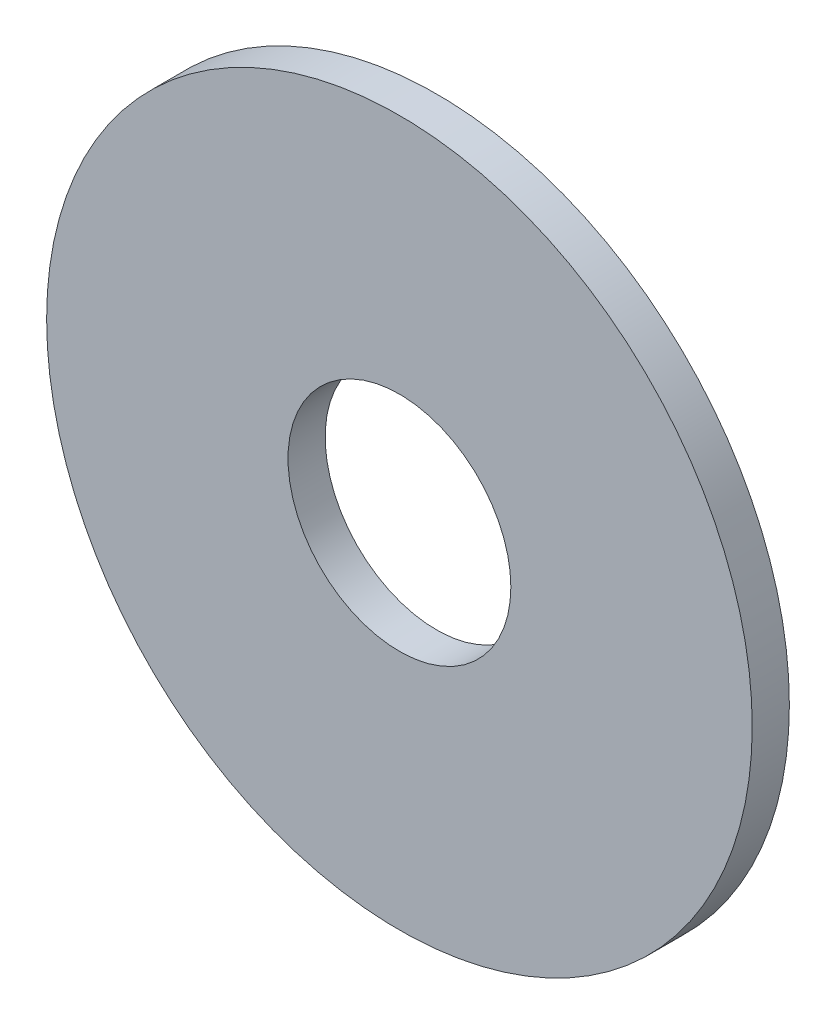
ISO-10303-21;
HEADER;
FILE_DESCRIPTION(('STEP AP214'),'2;1');
FILE_NAME('part.step','',(''),(''),'','','');
FILE_SCHEMA(('AUTOMOTIVE_DESIGN { 1 0 10303 214 1 1 1 1 }'));
ENDSEC;
DATA;
#1=APPLICATION_CONTEXT('core data for automotive mechanical design processes');
#2=APPLICATION_PROTOCOL_DEFINITION('international standard','automotive_design',2000,#1);
#3=PRODUCT_CONTEXT('',#1,'mechanical');
#4=PRODUCT('Part','Part','',(#3));
#5=PRODUCT_RELATED_PRODUCT_CATEGORY('part','',(#4));
#6=PRODUCT_DEFINITION_FORMATION('','',#4);
#7=PRODUCT_DEFINITION_CONTEXT('part definition',#1,'design');
#8=PRODUCT_DEFINITION('design','',#6,#7);
#9=PRODUCT_DEFINITION_SHAPE('','',#8);
#10=(LENGTH_UNIT() NAMED_UNIT(*) SI_UNIT(.MILLI.,.METRE.));
#11=(NAMED_UNIT(*) PLANE_ANGLE_UNIT() SI_UNIT($,.RADIAN.));
#12=(NAMED_UNIT(*) SI_UNIT($,.STERADIAN.) SOLID_ANGLE_UNIT());
#13=UNCERTAINTY_MEASURE_WITH_UNIT(LENGTH_MEASURE(1.E-05),#10,'distance_accuracy_value','');
#14=(GEOMETRIC_REPRESENTATION_CONTEXT(3) GLOBAL_UNCERTAINTY_ASSIGNED_CONTEXT((#13)) GLOBAL_UNIT_ASSIGNED_CONTEXT((#10,
#11,#12)) REPRESENTATION_CONTEXT('',''));
#15=CARTESIAN_POINT('',(0.,0.,0.));
#16=DIRECTION('',(0.,0.,1.));
#17=DIRECTION('',(1.,0.,0.));
#18=AXIS2_PLACEMENT_3D('',#15,#16,#17);
#19=CARTESIAN_POINT('',(0.,0.,1.));
#20=DIRECTION('',(0.,0.,1.));
#21=DIRECTION('',(1.,0.,0.));
#22=AXIS2_PLACEMENT_3D('',#19,#20,#21);
#23=PLANE('',#22);
#24=CARTESIAN_POINT('',(0.,0.,1.));
#25=DIRECTION('',(0.,0.,1.));
#26=DIRECTION('',(1.,0.,0.));
#27=AXIS2_PLACEMENT_3D('',#24,#25,#26);
#28=CIRCLE('',#27,9.5);
#29=CARTESIAN_POINT('',(9.5,0.,1.));
#30=VERTEX_POINT('',#29);
#31=EDGE_CURVE('E10',#30,#30,#28,.T.);
#32=ORIENTED_EDGE('',*,*,#31,.T.);
#33=EDGE_LOOP('',(#32));
#34=FACE_BOUND('',#33,.T.);
#35=CARTESIAN_POINT('',(0.,0.,1.));
#36=DIRECTION('',(0.,0.,1.));
#37=DIRECTION('',(1.,0.,0.));
#38=AXIS2_PLACEMENT_3D('',#35,#36,#37);
#39=CIRCLE('',#38,3.);
#40=CARTESIAN_POINT('',(3.,0.,1.));
#41=VERTEX_POINT('',#40);
#42=EDGE_CURVE('E51',#41,#41,#39,.T.);
#43=ORIENTED_EDGE('',*,*,#42,.F.);
#44=EDGE_LOOP('',(#43));
#45=FACE_BOUND('',#44,.T.);
#46=ADVANCED_FACE('F40',(#34,#45),#23,.T.);
#47=CARTESIAN_POINT('',(0.,0.,0.));
#48=DIRECTION('',(0.,0.,1.));
#49=DIRECTION('',(1.,0.,0.));
#50=AXIS2_PLACEMENT_3D('',#47,#48,#49);
#51=PLANE('',#50);
#52=CARTESIAN_POINT('',(0.,0.,0.));
#53=DIRECTION('',(0.,0.,1.));
#54=DIRECTION('',(1.,0.,0.));
#55=AXIS2_PLACEMENT_3D('',#52,#53,#54);
#56=CIRCLE('',#55,9.5);
#57=CARTESIAN_POINT('',(9.5,0.,0.));
#58=VERTEX_POINT('',#57);
#59=EDGE_CURVE('E44',#58,#58,#56,.T.);
#60=ORIENTED_EDGE('',*,*,#59,.F.);
#61=EDGE_LOOP('',(#60));
#62=FACE_BOUND('',#61,.T.);
#63=CARTESIAN_POINT('',(0.,0.,0.));
#64=DIRECTION('',(0.,0.,1.));
#65=DIRECTION('',(1.,0.,0.));
#66=AXIS2_PLACEMENT_3D('',#63,#64,#65);
#67=CIRCLE('',#66,3.);
#68=CARTESIAN_POINT('',(3.,0.,0.));
#69=VERTEX_POINT('',#68);
#70=EDGE_CURVE('E53',#69,#69,#67,.T.);
#71=ORIENTED_EDGE('',*,*,#70,.T.);
#72=EDGE_LOOP('',(#71));
#73=FACE_BOUND('',#72,.T.);
#74=ADVANCED_FACE('F63',(#62,#73),#51,.F.);
#75=CARTESIAN_POINT('',(0.,0.,1.));
#76=DIRECTION('',(0.,0.,-1.));
#77=DIRECTION('',(-1.,0.,0.));
#78=AXIS2_PLACEMENT_3D('',#75,#76,#77);
#79=CYLINDRICAL_SURFACE('',#78,9.5);
#80=ORIENTED_EDGE('',*,*,#31,.F.);
#81=EDGE_LOOP('',(#80));
#82=FACE_BOUND('',#81,.T.);
#83=ORIENTED_EDGE('',*,*,#59,.T.);
#84=EDGE_LOOP('',(#83));
#85=FACE_BOUND('',#84,.T.);
#86=ADVANCED_FACE('F42',(#82,#85),#79,.T.);
#87=CARTESIAN_POINT('',(0.,0.,1.));
#88=DIRECTION('',(0.,0.,-1.));
#89=DIRECTION('',(-1.,0.,0.));
#90=AXIS2_PLACEMENT_3D('',#87,#88,#89);
#91=CYLINDRICAL_SURFACE('',#90,3.);
#92=ORIENTED_EDGE('',*,*,#42,.T.);
#93=EDGE_LOOP('',(#92));
#94=FACE_BOUND('',#93,.T.);
#95=ORIENTED_EDGE('',*,*,#70,.F.);
#96=EDGE_LOOP('',(#95));
#97=FACE_BOUND('',#96,.T.);
#98=ADVANCED_FACE('F59',(#94,#97),#91,.F.);
#99=CLOSED_SHELL('',(#46,#74,#86,#98));
#100=MANIFOLD_SOLID_BREP('B2',#99);
#101=ADVANCED_BREP_SHAPE_REPRESENTATION('',(#18,#100),#14);
#102=SHAPE_DEFINITION_REPRESENTATION(#9,#101);
ENDSEC;
END-ISO-10303-21;
